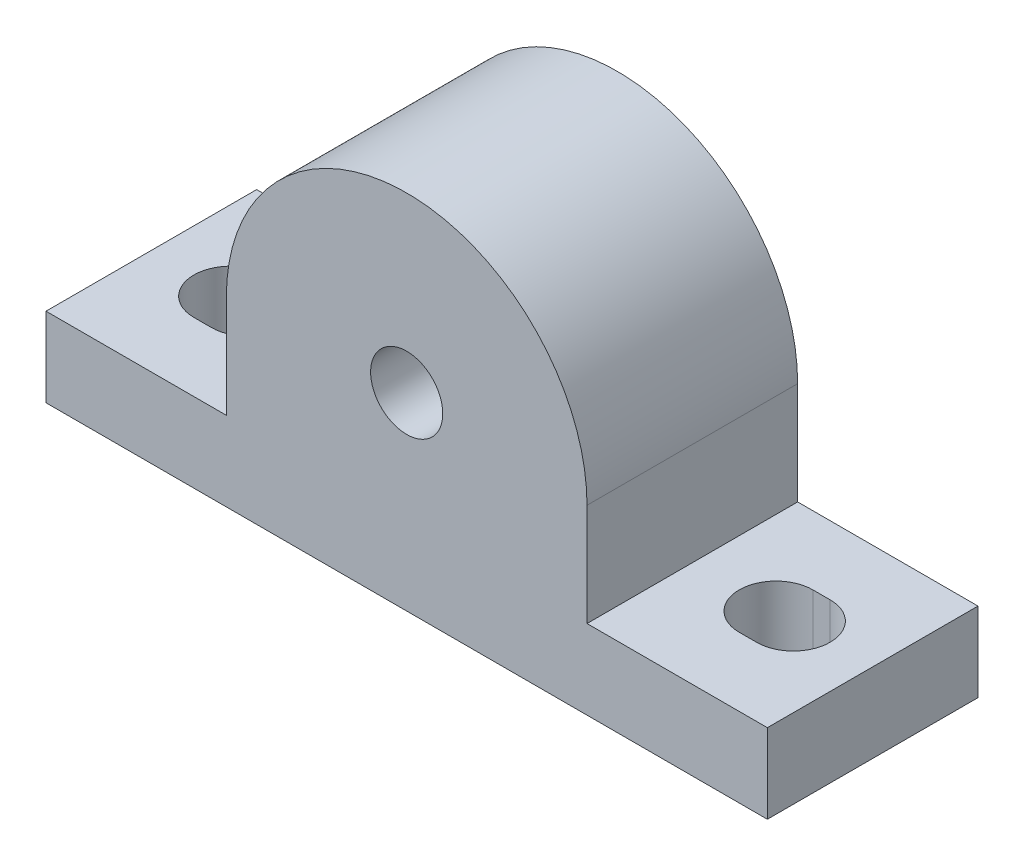
ISO-10303-21;
HEADER;
FILE_DESCRIPTION(('STEP AP214'),'2;1');
FILE_NAME('part.step','',(''),(''),'','','');
FILE_SCHEMA(('AUTOMOTIVE_DESIGN { 1 0 10303 214 1 1 1 1 }'));
ENDSEC;
DATA;
#1=APPLICATION_CONTEXT('core data for automotive mechanical design processes');
#2=APPLICATION_PROTOCOL_DEFINITION('international standard','automotive_design',2000,#1);
#3=PRODUCT_CONTEXT('',#1,'mechanical');
#4=PRODUCT('Part','Part','',(#3));
#5=PRODUCT_RELATED_PRODUCT_CATEGORY('part','',(#4));
#6=PRODUCT_DEFINITION_FORMATION('','',#4);
#7=PRODUCT_DEFINITION_CONTEXT('part definition',#1,'design');
#8=PRODUCT_DEFINITION('design','',#6,#7);
#9=PRODUCT_DEFINITION_SHAPE('','',#8);
#10=(LENGTH_UNIT() NAMED_UNIT(*) SI_UNIT(.MILLI.,.METRE.));
#11=(NAMED_UNIT(*) PLANE_ANGLE_UNIT() SI_UNIT($,.RADIAN.));
#12=(NAMED_UNIT(*) SI_UNIT($,.STERADIAN.) SOLID_ANGLE_UNIT());
#13=UNCERTAINTY_MEASURE_WITH_UNIT(LENGTH_MEASURE(1.E-05),#10,'distance_accuracy_value','');
#14=(GEOMETRIC_REPRESENTATION_CONTEXT(3) GLOBAL_UNCERTAINTY_ASSIGNED_CONTEXT((#13)) GLOBAL_UNIT_ASSIGNED_CONTEXT((#10,
#11,#12)) REPRESENTATION_CONTEXT('',''));
#15=CARTESIAN_POINT('',(0.,0.,0.));
#16=DIRECTION('',(0.,0.,1.));
#17=DIRECTION('',(1.,0.,0.));
#18=AXIS2_PLACEMENT_3D('',#15,#16,#17);
#19=CARTESIAN_POINT('',(0.,-1.27000000000001,18.542));
#20=DIRECTION('',(0.,0.,-1.));
#21=DIRECTION('',(-1.,0.,0.));
#22=AXIS2_PLACEMENT_3D('',#19,#20,#21);
#23=PLANE('',#22);
#24=DIRECTION('',(0.,-1.,0.));
#25=VECTOR('',#24,1.);
#26=CARTESIAN_POINT('',(-63.5,-33.274,18.542));
#27=LINE('',#26,#25);
#28=CARTESIAN_POINT('',(-63.5,-19.304,18.542));
#29=VERTEX_POINT('',#28);
#30=CARTESIAN_POINT('',(-63.5,-33.274,18.542));
#31=VERTEX_POINT('',#30);
#32=EDGE_CURVE('E202',#29,#31,#27,.T.);
#33=ORIENTED_EDGE('',*,*,#32,.T.);
#34=DIRECTION('',(1.,0.,0.));
#35=VECTOR('',#34,1.);
#36=CARTESIAN_POINT('',(-63.5,-33.274,18.542));
#37=LINE('',#36,#35);
#38=CARTESIAN_POINT('',(63.5,-33.274,18.542));
#39=VERTEX_POINT('',#38);
#40=EDGE_CURVE('E205',#31,#39,#37,.T.);
#41=ORIENTED_EDGE('',*,*,#40,.T.);
#42=DIRECTION('',(0.,1.,0.));
#43=VECTOR('',#42,1.);
#44=CARTESIAN_POINT('',(63.5,-19.304,18.542));
#45=LINE('',#44,#43);
#46=CARTESIAN_POINT('',(63.5,-19.304,18.542));
#47=VERTEX_POINT('',#46);
#48=EDGE_CURVE('E208',#39,#47,#45,.T.);
#49=ORIENTED_EDGE('',*,*,#48,.T.);
#50=DIRECTION('',(-1.,0.,0.));
#51=VECTOR('',#50,1.);
#52=CARTESIAN_POINT('',(31.75,-19.304,18.542));
#53=LINE('',#52,#51);
#54=CARTESIAN_POINT('',(31.75,-19.304,18.542));
#55=VERTEX_POINT('',#54);
#56=EDGE_CURVE('E210',#47,#55,#53,.T.);
#57=ORIENTED_EDGE('',*,*,#56,.T.);
#58=DIRECTION('',(0.,1.,0.));
#59=VECTOR('',#58,1.);
#60=CARTESIAN_POINT('',(31.75,-1.27000000000001,18.542));
#61=LINE('',#60,#59);
#62=CARTESIAN_POINT('',(31.75,-1.27000000000001,18.542));
#63=VERTEX_POINT('',#62);
#64=EDGE_CURVE('E212',#55,#63,#61,.T.);
#65=ORIENTED_EDGE('',*,*,#64,.T.);
#66=CARTESIAN_POINT('',(0.,-1.27000000000001,18.542));
#67=DIRECTION('',(0.,0.,1.));
#68=DIRECTION('',(-1.,0.,0.));
#69=AXIS2_PLACEMENT_3D('',#66,#67,#68);
#70=CIRCLE('',#69,31.75);
#71=CARTESIAN_POINT('',(-31.75,-1.27000000000001,18.542));
#72=VERTEX_POINT('',#71);
#73=EDGE_CURVE('E214',#63,#72,#70,.T.);
#74=ORIENTED_EDGE('',*,*,#73,.T.);
#75=DIRECTION('',(0.,-1.,0.));
#76=VECTOR('',#75,1.);
#77=CARTESIAN_POINT('',(-31.75,-1.27000000000001,18.542));
#78=LINE('',#77,#76);
#79=CARTESIAN_POINT('',(-31.75,-19.304,18.542));
#80=VERTEX_POINT('',#79);
#81=EDGE_CURVE('E216',#72,#80,#78,.T.);
#82=ORIENTED_EDGE('',*,*,#81,.T.);
#83=DIRECTION('',(-1.,0.,0.));
#84=VECTOR('',#83,1.);
#85=CARTESIAN_POINT('',(-63.5,-19.304,18.542));
#86=LINE('',#85,#84);
#87=EDGE_CURVE('E218',#80,#29,#86,.T.);
#88=ORIENTED_EDGE('',*,*,#87,.T.);
#89=EDGE_LOOP('',(#33,#41,#49,#57,#65,#74,#82,#88));
#90=FACE_BOUND('',#89,.T.);
#91=CARTESIAN_POINT('',(0.,0.,18.542));
#92=DIRECTION('',(0.,0.,1.));
#93=DIRECTION('',(1.,0.,0.));
#94=AXIS2_PLACEMENT_3D('',#91,#92,#93);
#95=CIRCLE('',#94,6.35);
#96=CARTESIAN_POINT('',(6.35,0.,18.542));
#97=VERTEX_POINT('',#96);
#98=EDGE_CURVE('E196',#97,#97,#95,.T.);
#99=ORIENTED_EDGE('',*,*,#98,.F.);
#100=EDGE_LOOP('',(#99));
#101=FACE_BOUND('',#100,.T.);
#102=ADVANCED_FACE('F34',(#90,#101),#23,.F.);
#103=CARTESIAN_POINT('',(0.,-1.27000000000001,-18.542));
#104=DIRECTION('',(0.,0.,-1.));
#105=DIRECTION('',(-1.,0.,0.));
#106=AXIS2_PLACEMENT_3D('',#103,#104,#105);
#107=PLANE('',#106);
#108=DIRECTION('',(0.,-1.,0.));
#109=VECTOR('',#108,1.);
#110=CARTESIAN_POINT('',(-63.5,-33.274,-18.542));
#111=LINE('',#110,#109);
#112=CARTESIAN_POINT('',(-63.5,-19.304,-18.542));
#113=VERTEX_POINT('',#112);
#114=CARTESIAN_POINT('',(-63.5,-33.274,-18.542));
#115=VERTEX_POINT('',#114);
#116=EDGE_CURVE('E199',#113,#115,#111,.T.);
#117=ORIENTED_EDGE('',*,*,#116,.F.);
#118=DIRECTION('',(-1.,0.,0.));
#119=VECTOR('',#118,1.);
#120=CARTESIAN_POINT('',(-63.5,-19.304,-18.542));
#121=LINE('',#120,#119);
#122=CARTESIAN_POINT('',(-31.75,-19.304,-18.542));
#123=VERTEX_POINT('',#122);
#124=EDGE_CURVE('E206',#123,#113,#121,.T.);
#125=ORIENTED_EDGE('',*,*,#124,.F.);
#126=DIRECTION('',(0.,-1.,0.));
#127=VECTOR('',#126,1.);
#128=CARTESIAN_POINT('',(-31.75,-1.27000000000001,-18.542));
#129=LINE('',#128,#127);
#130=CARTESIAN_POINT('',(-31.75,-1.27000000000001,-18.542));
#131=VERTEX_POINT('',#130);
#132=EDGE_CURVE('E233',#131,#123,#129,.T.);
#133=ORIENTED_EDGE('',*,*,#132,.F.);
#134=CARTESIAN_POINT('',(0.,-1.27000000000001,-18.542));
#135=DIRECTION('',(0.,0.,1.));
#136=DIRECTION('',(-1.,0.,0.));
#137=AXIS2_PLACEMENT_3D('',#134,#135,#136);
#138=CIRCLE('',#137,31.75);
#139=CARTESIAN_POINT('',(31.75,-1.27000000000001,-18.542));
#140=VERTEX_POINT('',#139);
#141=EDGE_CURVE('E231',#140,#131,#138,.T.);
#142=ORIENTED_EDGE('',*,*,#141,.F.);
#143=DIRECTION('',(0.,1.,0.));
#144=VECTOR('',#143,1.);
#145=CARTESIAN_POINT('',(31.75,-1.27000000000001,-18.542));
#146=LINE('',#145,#144);
#147=CARTESIAN_POINT('',(31.75,-19.304,-18.542));
#148=VERTEX_POINT('',#147);
#149=EDGE_CURVE('E229',#148,#140,#146,.T.);
#150=ORIENTED_EDGE('',*,*,#149,.F.);
#151=DIRECTION('',(-1.,0.,0.));
#152=VECTOR('',#151,1.);
#153=CARTESIAN_POINT('',(31.75,-19.304,-18.542));
#154=LINE('',#153,#152);
#155=CARTESIAN_POINT('',(63.5,-19.304,-18.542));
#156=VERTEX_POINT('',#155);
#157=EDGE_CURVE('E227',#156,#148,#154,.T.);
#158=ORIENTED_EDGE('',*,*,#157,.F.);
#159=DIRECTION('',(0.,1.,0.));
#160=VECTOR('',#159,1.);
#161=CARTESIAN_POINT('',(63.5,-19.304,-18.542));
#162=LINE('',#161,#160);
#163=CARTESIAN_POINT('',(63.5,-33.274,-18.542));
#164=VERTEX_POINT('',#163);
#165=EDGE_CURVE('E225',#164,#156,#162,.T.);
#166=ORIENTED_EDGE('',*,*,#165,.F.);
#167=DIRECTION('',(1.,0.,0.));
#168=VECTOR('',#167,1.);
#169=CARTESIAN_POINT('',(-63.5,-33.274,-18.542));
#170=LINE('',#169,#168);
#171=EDGE_CURVE('E223',#115,#164,#170,.T.);
#172=ORIENTED_EDGE('',*,*,#171,.F.);
#173=EDGE_LOOP('',(#117,#125,#133,#142,#150,#158,#166,#172));
#174=FACE_BOUND('',#173,.T.);
#175=CARTESIAN_POINT('',(0.,0.,-18.542));
#176=DIRECTION('',(0.,0.,1.));
#177=DIRECTION('',(1.,0.,0.));
#178=AXIS2_PLACEMENT_3D('',#175,#176,#177);
#179=CIRCLE('',#178,6.35);
#180=CARTESIAN_POINT('',(6.35,0.,-18.542));
#181=VERTEX_POINT('',#180);
#182=EDGE_CURVE('E189',#181,#181,#179,.T.);
#183=ORIENTED_EDGE('',*,*,#182,.T.);
#184=EDGE_LOOP('',(#183));
#185=FACE_BOUND('',#184,.T.);
#186=ADVANCED_FACE('F295',(#174,#185),#107,.T.);
#187=CARTESIAN_POINT('',(-63.5,-33.274,18.542));
#188=DIRECTION('',(1.,0.,0.));
#189=DIRECTION('',(0.,0.,-1.));
#190=AXIS2_PLACEMENT_3D('',#187,#188,#189);
#191=PLANE('',#190);
#192=ORIENTED_EDGE('',*,*,#116,.T.);
#193=DIRECTION('',(0.,0.,-1.));
#194=VECTOR('',#193,1.);
#195=CARTESIAN_POINT('',(-63.5,-33.274,18.542));
#196=LINE('',#195,#194);
#197=EDGE_CURVE('E256',#31,#115,#196,.T.);
#198=ORIENTED_EDGE('',*,*,#197,.F.);
#199=ORIENTED_EDGE('',*,*,#32,.F.);
#200=DIRECTION('',(0.,0.,-1.));
#201=VECTOR('',#200,1.);
#202=CARTESIAN_POINT('',(-63.5,-19.304,18.542));
#203=LINE('',#202,#201);
#204=EDGE_CURVE('E220',#29,#113,#203,.T.);
#205=ORIENTED_EDGE('',*,*,#204,.T.);
#206=EDGE_LOOP('',(#192,#198,#199,#205));
#207=FACE_BOUND('',#206,.T.);
#208=ADVANCED_FACE('F36',(#207),#191,.F.);
#209=CARTESIAN_POINT('',(-63.5,-33.274,18.542));
#210=DIRECTION('',(0.,1.,0.));
#211=DIRECTION('',(0.,0.,1.));
#212=AXIS2_PLACEMENT_3D('',#209,#210,#211);
#213=PLANE('',#212);
#214=DIRECTION('',(-1.,0.,0.));
#215=VECTOR('',#214,1.);
#216=CARTESIAN_POINT('',(49.53,-33.274,6.477));
#217=LINE('',#216,#215);
#218=CARTESIAN_POINT('',(49.53,-33.274,6.477));
#219=VERTEX_POINT('',#218);
#220=CARTESIAN_POINT('',(46.482,-33.274,6.477));
#221=VERTEX_POINT('',#220);
#222=EDGE_CURVE('E159',#219,#221,#217,.T.);
#223=ORIENTED_EDGE('',*,*,#222,.F.);
#224=CARTESIAN_POINT('',(49.53,-33.274,0.));
#225=DIRECTION('',(0.,-1.,0.));
#226=DIRECTION('',(0.,0.,1.));
#227=AXIS2_PLACEMENT_3D('',#224,#225,#226);
#228=CIRCLE('',#227,6.477);
#229=CARTESIAN_POINT('',(49.53,-33.274,-6.477));
#230=VERTEX_POINT('',#229);
#231=EDGE_CURVE('E49',#230,#219,#228,.T.);
#232=ORIENTED_EDGE('',*,*,#231,.F.);
#233=DIRECTION('',(1.,0.,0.));
#234=VECTOR('',#233,1.);
#235=CARTESIAN_POINT('',(49.53,-33.274,-6.477));
#236=LINE('',#235,#234);
#237=CARTESIAN_POINT('',(46.482,-33.274,-6.477));
#238=VERTEX_POINT('',#237);
#239=EDGE_CURVE('E166',#238,#230,#236,.T.);
#240=ORIENTED_EDGE('',*,*,#239,.F.);
#241=CARTESIAN_POINT('',(46.482,-33.274,0.));
#242=DIRECTION('',(0.,-1.,0.));
#243=DIRECTION('',(0.,0.,1.));
#244=AXIS2_PLACEMENT_3D('',#241,#242,#243);
#245=CIRCLE('',#244,6.477);
#246=EDGE_CURVE('E150',#221,#238,#245,.T.);
#247=ORIENTED_EDGE('',*,*,#246,.F.);
#248=EDGE_LOOP('',(#223,#232,#240,#247));
#249=FACE_BOUND('',#248,.T.);
#250=DIRECTION('',(1.,0.,0.));
#251=VECTOR('',#250,1.);
#252=CARTESIAN_POINT('',(-49.53,-33.274,-6.477));
#253=LINE('',#252,#251);
#254=CARTESIAN_POINT('',(-49.53,-33.274,-6.477));
#255=VERTEX_POINT('',#254);
#256=CARTESIAN_POINT('',(-46.482,-33.274,-6.477));
#257=VERTEX_POINT('',#256);
#258=EDGE_CURVE('E177',#255,#257,#253,.T.);
#259=ORIENTED_EDGE('',*,*,#258,.F.);
#260=CARTESIAN_POINT('',(-49.53,-33.274,0.));
#261=DIRECTION('',(0.,-1.,0.));
#262=DIRECTION('',(0.,0.,-1.));
#263=AXIS2_PLACEMENT_3D('',#260,#261,#262);
#264=CIRCLE('',#263,6.477);
#265=CARTESIAN_POINT('',(-49.53,-33.274,6.477));
#266=VERTEX_POINT('',#265);
#267=EDGE_CURVE('E173',#266,#255,#264,.T.);
#268=ORIENTED_EDGE('',*,*,#267,.F.);
#269=DIRECTION('',(-1.,0.,0.));
#270=VECTOR('',#269,1.);
#271=CARTESIAN_POINT('',(-49.53,-33.274,6.477));
#272=LINE('',#271,#270);
#273=CARTESIAN_POINT('',(-46.482,-33.274,6.477));
#274=VERTEX_POINT('',#273);
#275=EDGE_CURVE('E183',#274,#266,#272,.T.);
#276=ORIENTED_EDGE('',*,*,#275,.F.);
#277=CARTESIAN_POINT('',(-46.482,-33.274,0.));
#278=DIRECTION('',(0.,-1.,0.));
#279=DIRECTION('',(0.,0.,-1.));
#280=AXIS2_PLACEMENT_3D('',#277,#278,#279);
#281=CIRCLE('',#280,6.477);
#282=EDGE_CURVE('E180',#257,#274,#281,.T.);
#283=ORIENTED_EDGE('',*,*,#282,.F.);
#284=EDGE_LOOP('',(#259,#268,#276,#283));
#285=FACE_BOUND('',#284,.T.);
#286=ORIENTED_EDGE('',*,*,#171,.T.);
#287=DIRECTION('',(0.,0.,-1.));
#288=VECTOR('',#287,1.);
#289=CARTESIAN_POINT('',(63.5,-33.274,18.542));
#290=LINE('',#289,#288);
#291=EDGE_CURVE('E253',#39,#164,#290,.T.);
#292=ORIENTED_EDGE('',*,*,#291,.F.);
#293=ORIENTED_EDGE('',*,*,#40,.F.);
#294=ORIENTED_EDGE('',*,*,#197,.T.);
#295=EDGE_LOOP('',(#286,#292,#293,#294));
#296=FACE_BOUND('',#295,.T.);
#297=ADVANCED_FACE('F163',(#249,#285,#296),#213,.F.);
#298=CARTESIAN_POINT('',(63.5,-19.304,18.542));
#299=DIRECTION('',(-1.,0.,0.));
#300=DIRECTION('',(0.,0.,1.));
#301=AXIS2_PLACEMENT_3D('',#298,#299,#300);
#302=PLANE('',#301);
#303=ORIENTED_EDGE('',*,*,#165,.T.);
#304=DIRECTION('',(0.,0.,-1.));
#305=VECTOR('',#304,1.);
#306=CARTESIAN_POINT('',(63.5,-19.304,18.542));
#307=LINE('',#306,#305);
#308=EDGE_CURVE('E250',#47,#156,#307,.T.);
#309=ORIENTED_EDGE('',*,*,#308,.F.);
#310=ORIENTED_EDGE('',*,*,#48,.F.);
#311=ORIENTED_EDGE('',*,*,#291,.T.);
#312=EDGE_LOOP('',(#303,#309,#310,#311));
#313=FACE_BOUND('',#312,.T.);
#314=ADVANCED_FACE('F326',(#313),#302,.F.);
#315=CARTESIAN_POINT('',(31.75,-19.304,18.542));
#316=DIRECTION('',(0.,-1.,0.));
#317=DIRECTION('',(0.,0.,-1.));
#318=AXIS2_PLACEMENT_3D('',#315,#316,#317);
#319=PLANE('',#318);
#320=DIRECTION('',(1.,0.,0.));
#321=VECTOR('',#320,1.);
#322=CARTESIAN_POINT('',(31.75,-19.304,-6.477));
#323=LINE('',#322,#321);
#324=CARTESIAN_POINT('',(46.482,-19.304,-6.477));
#325=VERTEX_POINT('',#324);
#326=CARTESIAN_POINT('',(49.53,-19.304,-6.477));
#327=VERTEX_POINT('',#326);
#328=EDGE_CURVE('E42',#325,#327,#323,.T.);
#329=ORIENTED_EDGE('',*,*,#328,.T.);
#330=CARTESIAN_POINT('',(49.53,-19.304,0.));
#331=DIRECTION('',(0.,-1.,0.));
#332=DIRECTION('',(0.,0.,-1.));
#333=AXIS2_PLACEMENT_3D('',#330,#331,#332);
#334=CIRCLE('',#333,6.477);
#335=CARTESIAN_POINT('',(49.53,-19.304,6.477));
#336=VERTEX_POINT('',#335);
#337=EDGE_CURVE('E11',#327,#336,#334,.T.);
#338=ORIENTED_EDGE('',*,*,#337,.T.);
#339=DIRECTION('',(-1.,0.,0.));
#340=VECTOR('',#339,1.);
#341=CARTESIAN_POINT('',(31.75,-19.304,6.477));
#342=LINE('',#341,#340);
#343=CARTESIAN_POINT('',(46.482,-19.304,6.477));
#344=VERTEX_POINT('',#343);
#345=EDGE_CURVE('E271',#336,#344,#342,.T.);
#346=ORIENTED_EDGE('',*,*,#345,.T.);
#347=CARTESIAN_POINT('',(46.482,-19.304,0.));
#348=DIRECTION('',(0.,-1.,0.));
#349=DIRECTION('',(0.,0.,-1.));
#350=AXIS2_PLACEMENT_3D('',#347,#348,#349);
#351=CIRCLE('',#350,6.477);
#352=EDGE_CURVE('E153',#344,#325,#351,.T.);
#353=ORIENTED_EDGE('',*,*,#352,.T.);
#354=EDGE_LOOP('',(#329,#338,#346,#353));
#355=FACE_BOUND('',#354,.T.);
#356=ORIENTED_EDGE('',*,*,#157,.T.);
#357=DIRECTION('',(0.,0.,-1.));
#358=VECTOR('',#357,1.);
#359=CARTESIAN_POINT('',(31.75,-19.304,18.542));
#360=LINE('',#359,#358);
#361=EDGE_CURVE('E247',#55,#148,#360,.T.);
#362=ORIENTED_EDGE('',*,*,#361,.F.);
#363=ORIENTED_EDGE('',*,*,#56,.F.);
#364=ORIENTED_EDGE('',*,*,#308,.T.);
#365=EDGE_LOOP('',(#356,#362,#363,#364));
#366=FACE_BOUND('',#365,.T.);
#367=ADVANCED_FACE('F275',(#355,#366),#319,.F.);
#368=CARTESIAN_POINT('',(31.75,-1.27000000000001,18.542));
#369=DIRECTION('',(-1.,0.,0.));
#370=DIRECTION('',(0.,0.,1.));
#371=AXIS2_PLACEMENT_3D('',#368,#369,#370);
#372=PLANE('',#371);
#373=ORIENTED_EDGE('',*,*,#149,.T.);
#374=DIRECTION('',(0.,0.,-1.));
#375=VECTOR('',#374,1.);
#376=CARTESIAN_POINT('',(31.75,-1.27000000000001,18.542));
#377=LINE('',#376,#375);
#378=EDGE_CURVE('E244',#63,#140,#377,.T.);
#379=ORIENTED_EDGE('',*,*,#378,.F.);
#380=ORIENTED_EDGE('',*,*,#64,.F.);
#381=ORIENTED_EDGE('',*,*,#361,.T.);
#382=EDGE_LOOP('',(#373,#379,#380,#381));
#383=FACE_BOUND('',#382,.T.);
#384=ADVANCED_FACE('F319',(#383),#372,.F.);
#385=CARTESIAN_POINT('',(0.,-1.27000000000001,18.542));
#386=DIRECTION('',(0.,0.,-1.));
#387=DIRECTION('',(-1.,0.,0.));
#388=AXIS2_PLACEMENT_3D('',#385,#386,#387);
#389=CYLINDRICAL_SURFACE('',#388,31.75);
#390=ORIENTED_EDGE('',*,*,#141,.T.);
#391=DIRECTION('',(0.,0.,-1.));
#392=VECTOR('',#391,1.);
#393=CARTESIAN_POINT('',(-31.75,-1.27000000000001,18.542));
#394=LINE('',#393,#392);
#395=EDGE_CURVE('E241',#72,#131,#394,.T.);
#396=ORIENTED_EDGE('',*,*,#395,.F.);
#397=ORIENTED_EDGE('',*,*,#73,.F.);
#398=ORIENTED_EDGE('',*,*,#378,.T.);
#399=EDGE_LOOP('',(#390,#396,#397,#398));
#400=FACE_BOUND('',#399,.T.);
#401=ADVANCED_FACE('F315',(#400),#389,.T.);
#402=CARTESIAN_POINT('',(-31.75,-1.27000000000001,18.542));
#403=DIRECTION('',(1.,0.,0.));
#404=DIRECTION('',(0.,0.,-1.));
#405=AXIS2_PLACEMENT_3D('',#402,#403,#404);
#406=PLANE('',#405);
#407=ORIENTED_EDGE('',*,*,#132,.T.);
#408=DIRECTION('',(0.,0.,-1.));
#409=VECTOR('',#408,1.);
#410=CARTESIAN_POINT('',(-31.75,-19.304,18.542));
#411=LINE('',#410,#409);
#412=EDGE_CURVE('E238',#80,#123,#411,.T.);
#413=ORIENTED_EDGE('',*,*,#412,.F.);
#414=ORIENTED_EDGE('',*,*,#81,.F.);
#415=ORIENTED_EDGE('',*,*,#395,.T.);
#416=EDGE_LOOP('',(#407,#413,#414,#415));
#417=FACE_BOUND('',#416,.T.);
#418=ADVANCED_FACE('F311',(#417),#406,.F.);
#419=CARTESIAN_POINT('',(-63.5,-19.304,18.542));
#420=DIRECTION('',(0.,-1.,0.));
#421=DIRECTION('',(0.,0.,-1.));
#422=AXIS2_PLACEMENT_3D('',#419,#420,#421);
#423=PLANE('',#422);
#424=DIRECTION('',(-1.,0.,0.));
#425=VECTOR('',#424,1.);
#426=CARTESIAN_POINT('',(-63.5,-19.304,6.477));
#427=LINE('',#426,#425);
#428=CARTESIAN_POINT('',(-46.482,-19.304,6.477));
#429=VERTEX_POINT('',#428);
#430=CARTESIAN_POINT('',(-49.53,-19.304,6.477));
#431=VERTEX_POINT('',#430);
#432=EDGE_CURVE('E265',#429,#431,#427,.T.);
#433=ORIENTED_EDGE('',*,*,#432,.T.);
#434=CARTESIAN_POINT('',(-49.53,-19.304,0.));
#435=DIRECTION('',(0.,-1.,0.));
#436=DIRECTION('',(0.,0.,-1.));
#437=AXIS2_PLACEMENT_3D('',#434,#435,#436);
#438=CIRCLE('',#437,6.477);
#439=CARTESIAN_POINT('',(-49.53,-19.304,-6.477));
#440=VERTEX_POINT('',#439);
#441=EDGE_CURVE('E268',#431,#440,#438,.T.);
#442=ORIENTED_EDGE('',*,*,#441,.T.);
#443=DIRECTION('',(1.,0.,0.));
#444=VECTOR('',#443,1.);
#445=CARTESIAN_POINT('',(-63.5,-19.304,-6.477));
#446=LINE('',#445,#444);
#447=CARTESIAN_POINT('',(-46.482,-19.304,-6.477));
#448=VERTEX_POINT('',#447);
#449=EDGE_CURVE('E259',#440,#448,#446,.T.);
#450=ORIENTED_EDGE('',*,*,#449,.T.);
#451=CARTESIAN_POINT('',(-46.482,-19.304,0.));
#452=DIRECTION('',(0.,-1.,0.));
#453=DIRECTION('',(0.,0.,-1.));
#454=AXIS2_PLACEMENT_3D('',#451,#452,#453);
#455=CIRCLE('',#454,6.477);
#456=EDGE_CURVE('E262',#448,#429,#455,.T.);
#457=ORIENTED_EDGE('',*,*,#456,.T.);
#458=EDGE_LOOP('',(#433,#442,#450,#457));
#459=FACE_BOUND('',#458,.T.);
#460=ORIENTED_EDGE('',*,*,#124,.T.);
#461=ORIENTED_EDGE('',*,*,#204,.F.);
#462=ORIENTED_EDGE('',*,*,#87,.F.);
#463=ORIENTED_EDGE('',*,*,#412,.T.);
#464=EDGE_LOOP('',(#460,#461,#462,#463));
#465=FACE_BOUND('',#464,.T.);
#466=ADVANCED_FACE('F308',(#459,#465),#423,.F.);
#467=CARTESIAN_POINT('',(0.,0.,18.542));
#468=DIRECTION('',(0.,0.,-1.));
#469=DIRECTION('',(-1.,0.,0.));
#470=AXIS2_PLACEMENT_3D('',#467,#468,#469);
#471=CYLINDRICAL_SURFACE('',#470,6.35);
#472=ORIENTED_EDGE('',*,*,#98,.T.);
#473=EDGE_LOOP('',(#472));
#474=FACE_BOUND('',#473,.T.);
#475=ORIENTED_EDGE('',*,*,#182,.F.);
#476=EDGE_LOOP('',(#475));
#477=FACE_BOUND('',#476,.T.);
#478=ADVANCED_FACE('F305',(#474,#477),#471,.F.);
#479=CARTESIAN_POINT('',(-49.53,30.48,0.));
#480=DIRECTION('',(0.,-1.,0.));
#481=DIRECTION('',(0.,0.,-1.));
#482=AXIS2_PLACEMENT_3D('',#479,#480,#481);
#483=CYLINDRICAL_SURFACE('',#482,6.477);
#484=DIRECTION('',(0.,-1.,0.));
#485=VECTOR('',#484,1.);
#486=CARTESIAN_POINT('',(-49.53,30.48,6.477));
#487=LINE('',#486,#485);
#488=EDGE_CURVE('E187',#431,#266,#487,.T.);
#489=ORIENTED_EDGE('',*,*,#488,.T.);
#490=ORIENTED_EDGE('',*,*,#267,.T.);
#491=DIRECTION('',(0.,-1.,0.));
#492=VECTOR('',#491,1.);
#493=CARTESIAN_POINT('',(-49.53,30.48,-6.477));
#494=LINE('',#493,#492);
#495=EDGE_CURVE('E186',#440,#255,#494,.T.);
#496=ORIENTED_EDGE('',*,*,#495,.F.);
#497=ORIENTED_EDGE('',*,*,#441,.F.);
#498=EDGE_LOOP('',(#489,#490,#496,#497));
#499=FACE_BOUND('',#498,.T.);
#500=ADVANCED_FACE('F364',(#499),#483,.F.);
#501=CARTESIAN_POINT('',(-49.53,30.48,6.477));
#502=DIRECTION('',(0.,0.,1.));
#503=DIRECTION('',(1.,0.,0.));
#504=AXIS2_PLACEMENT_3D('',#501,#502,#503);
#505=PLANE('',#504);
#506=DIRECTION('',(0.,-1.,0.));
#507=VECTOR('',#506,1.);
#508=CARTESIAN_POINT('',(-46.482,30.48,6.477));
#509=LINE('',#508,#507);
#510=EDGE_CURVE('E190',#429,#274,#509,.T.);
#511=ORIENTED_EDGE('',*,*,#510,.T.);
#512=ORIENTED_EDGE('',*,*,#275,.T.);
#513=ORIENTED_EDGE('',*,*,#488,.F.);
#514=ORIENTED_EDGE('',*,*,#432,.F.);
#515=EDGE_LOOP('',(#511,#512,#513,#514));
#516=FACE_BOUND('',#515,.T.);
#517=ADVANCED_FACE('F369',(#516),#505,.F.);
#518=CARTESIAN_POINT('',(-46.482,30.48,0.));
#519=DIRECTION('',(0.,-1.,0.));
#520=DIRECTION('',(0.,0.,-1.));
#521=AXIS2_PLACEMENT_3D('',#518,#519,#520);
#522=CYLINDRICAL_SURFACE('',#521,6.477);
#523=DIRECTION('',(0.,-1.,0.));
#524=VECTOR('',#523,1.);
#525=CARTESIAN_POINT('',(-46.482,30.48,-6.477));
#526=LINE('',#525,#524);
#527=EDGE_CURVE('E192',#448,#257,#526,.T.);
#528=ORIENTED_EDGE('',*,*,#527,.T.);
#529=ORIENTED_EDGE('',*,*,#282,.T.);
#530=ORIENTED_EDGE('',*,*,#510,.F.);
#531=ORIENTED_EDGE('',*,*,#456,.F.);
#532=EDGE_LOOP('',(#528,#529,#530,#531));
#533=FACE_BOUND('',#532,.T.);
#534=ADVANCED_FACE('F289',(#533),#522,.F.);
#535=CARTESIAN_POINT('',(-49.53,30.48,-6.477));
#536=DIRECTION('',(0.,0.,-1.));
#537=DIRECTION('',(-1.,0.,0.));
#538=AXIS2_PLACEMENT_3D('',#535,#536,#537);
#539=PLANE('',#538);
#540=ORIENTED_EDGE('',*,*,#495,.T.);
#541=ORIENTED_EDGE('',*,*,#258,.T.);
#542=ORIENTED_EDGE('',*,*,#527,.F.);
#543=ORIENTED_EDGE('',*,*,#449,.F.);
#544=EDGE_LOOP('',(#540,#541,#542,#543));
#545=FACE_BOUND('',#544,.T.);
#546=ADVANCED_FACE('F282',(#545),#539,.F.);
#547=CARTESIAN_POINT('',(49.53,30.48,0.));
#548=DIRECTION('',(0.,-1.,0.));
#549=DIRECTION('',(0.,0.,-1.));
#550=AXIS2_PLACEMENT_3D('',#547,#548,#549);
#551=CYLINDRICAL_SURFACE('',#550,6.477);
#552=DIRECTION('',(0.,-1.,0.));
#553=VECTOR('',#552,1.);
#554=CARTESIAN_POINT('',(49.53,30.48,-6.477));
#555=LINE('',#554,#553);
#556=EDGE_CURVE('E171',#327,#230,#555,.T.);
#557=ORIENTED_EDGE('',*,*,#556,.T.);
#558=ORIENTED_EDGE('',*,*,#231,.T.);
#559=DIRECTION('',(0.,-1.,0.));
#560=VECTOR('',#559,1.);
#561=CARTESIAN_POINT('',(49.53,30.48,6.477));
#562=LINE('',#561,#560);
#563=EDGE_CURVE('E156',#336,#219,#562,.T.);
#564=ORIENTED_EDGE('',*,*,#563,.F.);
#565=ORIENTED_EDGE('',*,*,#337,.F.);
#566=EDGE_LOOP('',(#557,#558,#564,#565));
#567=FACE_BOUND('',#566,.T.);
#568=ADVANCED_FACE('F280',(#567),#551,.F.);
#569=CARTESIAN_POINT('',(49.53,30.48,-6.477));
#570=DIRECTION('',(0.,0.,-1.));
#571=DIRECTION('',(-1.,0.,0.));
#572=AXIS2_PLACEMENT_3D('',#569,#570,#571);
#573=PLANE('',#572);
#574=DIRECTION('',(0.,-1.,0.));
#575=VECTOR('',#574,1.);
#576=CARTESIAN_POINT('',(46.482,30.48,-6.477));
#577=LINE('',#576,#575);
#578=EDGE_CURVE('E155',#325,#238,#577,.T.);
#579=ORIENTED_EDGE('',*,*,#578,.T.);
#580=ORIENTED_EDGE('',*,*,#239,.T.);
#581=ORIENTED_EDGE('',*,*,#556,.F.);
#582=ORIENTED_EDGE('',*,*,#328,.F.);
#583=EDGE_LOOP('',(#579,#580,#581,#582));
#584=FACE_BOUND('',#583,.T.);
#585=ADVANCED_FACE('F279',(#584),#573,.F.);
#586=CARTESIAN_POINT('',(46.482,30.48,0.));
#587=DIRECTION('',(0.,-1.,0.));
#588=DIRECTION('',(0.,0.,-1.));
#589=AXIS2_PLACEMENT_3D('',#586,#587,#588);
#590=CYLINDRICAL_SURFACE('',#589,6.477);
#591=DIRECTION('',(0.,-1.,0.));
#592=VECTOR('',#591,1.);
#593=CARTESIAN_POINT('',(46.482,30.48,6.477));
#594=LINE('',#593,#592);
#595=EDGE_CURVE('E57',#344,#221,#594,.T.);
#596=ORIENTED_EDGE('',*,*,#595,.T.);
#597=ORIENTED_EDGE('',*,*,#246,.T.);
#598=ORIENTED_EDGE('',*,*,#578,.F.);
#599=ORIENTED_EDGE('',*,*,#352,.F.);
#600=EDGE_LOOP('',(#596,#597,#598,#599));
#601=FACE_BOUND('',#600,.T.);
#602=ADVANCED_FACE('F147',(#601),#590,.F.);
#603=CARTESIAN_POINT('',(49.53,30.48,6.477));
#604=DIRECTION('',(0.,0.,1.));
#605=DIRECTION('',(1.,0.,0.));
#606=AXIS2_PLACEMENT_3D('',#603,#604,#605);
#607=PLANE('',#606);
#608=ORIENTED_EDGE('',*,*,#563,.T.);
#609=ORIENTED_EDGE('',*,*,#222,.T.);
#610=ORIENTED_EDGE('',*,*,#595,.F.);
#611=ORIENTED_EDGE('',*,*,#345,.F.);
#612=EDGE_LOOP('',(#608,#609,#610,#611));
#613=FACE_BOUND('',#612,.T.);
#614=ADVANCED_FACE('F160',(#613),#607,.F.);
#615=CLOSED_SHELL('',(#102,#186,#208,#297,#314,#367,#384,#401,#418,#466,#478,#500,#517,#534,
#546,#568,#585,#602,#614));
#616=MANIFOLD_SOLID_BREP('B2',#615);
#617=ADVANCED_BREP_SHAPE_REPRESENTATION('',(#18,#616),#14);
#618=SHAPE_DEFINITION_REPRESENTATION(#9,#617);
ENDSEC;
END-ISO-10303-21;
